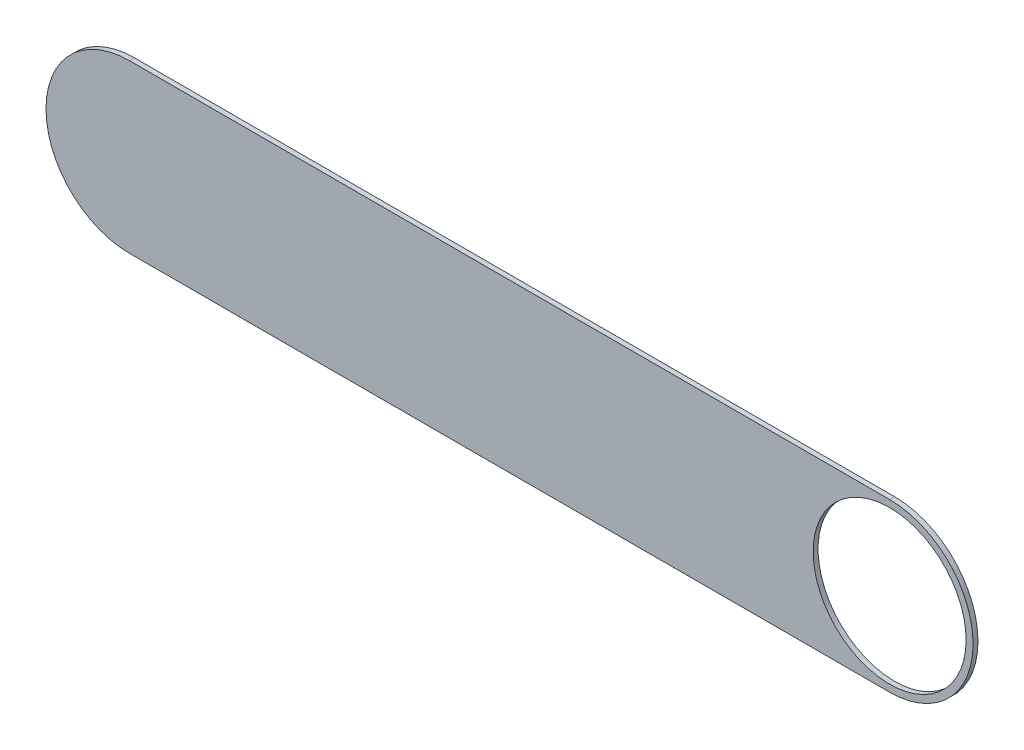
ISO-10303-21;
HEADER;
FILE_DESCRIPTION(('STEP AP214'),'2;1');
FILE_NAME('part.step','',(''),(''),'','','');
FILE_SCHEMA(('AUTOMOTIVE_DESIGN { 1 0 10303 214 1 1 1 1 }'));
ENDSEC;
DATA;
#1=APPLICATION_CONTEXT('core data for automotive mechanical design processes');
#2=APPLICATION_PROTOCOL_DEFINITION('international standard','automotive_design',2000,#1);
#3=PRODUCT_CONTEXT('',#1,'mechanical');
#4=PRODUCT('Part','Part','',(#3));
#5=PRODUCT_RELATED_PRODUCT_CATEGORY('part','',(#4));
#6=PRODUCT_DEFINITION_FORMATION('','',#4);
#7=PRODUCT_DEFINITION_CONTEXT('part definition',#1,'design');
#8=PRODUCT_DEFINITION('design','',#6,#7);
#9=PRODUCT_DEFINITION_SHAPE('','',#8);
#10=(LENGTH_UNIT() NAMED_UNIT(*) SI_UNIT(.MILLI.,.METRE.));
#11=(NAMED_UNIT(*) PLANE_ANGLE_UNIT() SI_UNIT($,.RADIAN.));
#12=(NAMED_UNIT(*) SI_UNIT($,.STERADIAN.) SOLID_ANGLE_UNIT());
#13=UNCERTAINTY_MEASURE_WITH_UNIT(LENGTH_MEASURE(1.E-05),#10,'distance_accuracy_value','');
#14=(GEOMETRIC_REPRESENTATION_CONTEXT(3) GLOBAL_UNCERTAINTY_ASSIGNED_CONTEXT((#13)) GLOBAL_UNIT_ASSIGNED_CONTEXT((#10,
#11,#12)) REPRESENTATION_CONTEXT('',''));
#15=CARTESIAN_POINT('',(0.,0.,0.));
#16=DIRECTION('',(0.,0.,1.));
#17=DIRECTION('',(1.,0.,0.));
#18=AXIS2_PLACEMENT_3D('',#15,#16,#17);
#19=CARTESIAN_POINT('',(91.2368,69.980048,0.));
#20=DIRECTION('',(0.,1.,0.));
#21=DIRECTION('',(1.,0.,0.));
#22=AXIS2_PLACEMENT_3D('',#19,#20,#21);
#23=PLANE('',#22);
#24=DIRECTION('',(1.,0.,0.));
#25=VECTOR('',#24,1.);
#26=CARTESIAN_POINT('',(91.2368,69.980048,0.03556));
#27=LINE('',#26,#25);
#28=CARTESIAN_POINT('',(91.2368,69.980048,0.03556));
#29=VERTEX_POINT('',#28);
#30=CARTESIAN_POINT('',(96.70415,69.980048,0.03556));
#31=VERTEX_POINT('',#30);
#32=EDGE_CURVE('E11',#29,#31,#27,.T.);
#33=ORIENTED_EDGE('',*,*,#32,.F.);
#34=DIRECTION('',(0.,0.,1.));
#35=VECTOR('',#34,1.);
#36=CARTESIAN_POINT('',(91.2368,69.980048,0.));
#37=LINE('',#36,#35);
#38=CARTESIAN_POINT('',(91.2368,69.980048,0.));
#39=VERTEX_POINT('',#38);
#40=EDGE_CURVE('E24',#39,#29,#37,.T.);
#41=ORIENTED_EDGE('',*,*,#40,.F.);
#42=DIRECTION('',(1.,0.,0.));
#43=VECTOR('',#42,1.);
#44=CARTESIAN_POINT('',(91.2368,69.980048,0.));
#45=LINE('',#44,#43);
#46=CARTESIAN_POINT('',(96.70415,69.980048,0.));
#47=VERTEX_POINT('',#46);
#48=EDGE_CURVE('E96',#39,#47,#45,.T.);
#49=ORIENTED_EDGE('',*,*,#48,.T.);
#50=DIRECTION('',(0.,0.,1.));
#51=VECTOR('',#50,1.);
#52=CARTESIAN_POINT('',(96.70415,69.980048,0.));
#53=LINE('',#52,#51);
#54=EDGE_CURVE('E37',#47,#31,#53,.T.);
#55=ORIENTED_EDGE('',*,*,#54,.T.);
#56=EDGE_LOOP('',(#33,#41,#49,#55));
#57=FACE_BOUND('',#56,.T.);
#58=ADVANCED_FACE('F17',(#57),#23,.F.);
#59=CARTESIAN_POINT('',(91.2368,70.5800468,0.));
#60=DIRECTION('',(0.,0.,-1.));
#61=DIRECTION('',(0.,1.,0.));
#62=AXIS2_PLACEMENT_3D('',#59,#60,#61);
#63=CYLINDRICAL_SURFACE('',#62,0.599998800000004);
#64=CARTESIAN_POINT('',(91.2368,70.5800468,0.03556));
#65=DIRECTION('',(0.,0.,1.));
#66=DIRECTION('',(0.,1.,0.));
#67=AXIS2_PLACEMENT_3D('',#64,#65,#66);
#68=CIRCLE('',#67,0.599998800000004);
#69=CARTESIAN_POINT('',(91.2368,71.1800456,0.03556));
#70=VERTEX_POINT('',#69);
#71=EDGE_CURVE('E92',#70,#29,#68,.T.);
#72=ORIENTED_EDGE('',*,*,#71,.F.);
#73=DIRECTION('',(0.,0.,1.));
#74=VECTOR('',#73,1.);
#75=CARTESIAN_POINT('',(91.2368,71.1800456,0.));
#76=LINE('',#75,#74);
#77=CARTESIAN_POINT('',(91.2368,71.1800456,0.));
#78=VERTEX_POINT('',#77);
#79=EDGE_CURVE('E90',#78,#70,#76,.T.);
#80=ORIENTED_EDGE('',*,*,#79,.F.);
#81=CARTESIAN_POINT('',(91.2368,70.5800468,0.));
#82=DIRECTION('',(0.,0.,1.));
#83=DIRECTION('',(0.,1.,0.));
#84=AXIS2_PLACEMENT_3D('',#81,#82,#83);
#85=CIRCLE('',#84,0.599998800000004);
#86=EDGE_CURVE('E88',#78,#39,#85,.T.);
#87=ORIENTED_EDGE('',*,*,#86,.T.);
#88=ORIENTED_EDGE('',*,*,#40,.T.);
#89=EDGE_LOOP('',(#72,#80,#87,#88));
#90=FACE_BOUND('',#89,.T.);
#91=ADVANCED_FACE('F111',(#90),#63,.T.);
#92=CARTESIAN_POINT('',(96.70415,70.5800468,0.));
#93=DIRECTION('',(0.,0.,-1.));
#94=DIRECTION('',(0.,-1.,0.));
#95=AXIS2_PLACEMENT_3D('',#92,#93,#94);
#96=CYLINDRICAL_SURFACE('',#95,0.599998800000004);
#97=CARTESIAN_POINT('',(96.70415,70.5800468,0.03556));
#98=DIRECTION('',(0.,0.,1.));
#99=DIRECTION('',(0.,-1.,0.));
#100=AXIS2_PLACEMENT_3D('',#97,#98,#99);
#101=CIRCLE('',#100,0.599998800000004);
#102=CARTESIAN_POINT('',(96.70415,71.1800456,0.03556));
#103=VERTEX_POINT('',#102);
#104=EDGE_CURVE('E85',#31,#103,#101,.T.);
#105=ORIENTED_EDGE('',*,*,#104,.F.);
#106=ORIENTED_EDGE('',*,*,#54,.F.);
#107=CARTESIAN_POINT('',(96.70415,70.5800468,0.));
#108=DIRECTION('',(0.,0.,1.));
#109=DIRECTION('',(0.,-1.,0.));
#110=AXIS2_PLACEMENT_3D('',#107,#108,#109);
#111=CIRCLE('',#110,0.599998800000004);
#112=CARTESIAN_POINT('',(96.70415,71.1800456,0.));
#113=VERTEX_POINT('',#112);
#114=EDGE_CURVE('E82',#47,#113,#111,.T.);
#115=ORIENTED_EDGE('',*,*,#114,.T.);
#116=DIRECTION('',(0.,0.,1.));
#117=VECTOR('',#116,1.);
#118=CARTESIAN_POINT('',(96.70415,71.1800456,0.));
#119=LINE('',#118,#117);
#120=EDGE_CURVE('E80',#113,#103,#119,.T.);
#121=ORIENTED_EDGE('',*,*,#120,.T.);
#122=EDGE_LOOP('',(#105,#106,#115,#121));
#123=FACE_BOUND('',#122,.T.);
#124=ADVANCED_FACE('F104',(#123),#96,.T.);
#125=CARTESIAN_POINT('',(96.70415,71.1800456,0.));
#126=DIRECTION('',(0.,-1.,0.));
#127=DIRECTION('',(-1.,0.,0.));
#128=AXIS2_PLACEMENT_3D('',#125,#126,#127);
#129=PLANE('',#128);
#130=DIRECTION('',(-1.,0.,0.));
#131=VECTOR('',#130,1.);
#132=CARTESIAN_POINT('',(96.70415,71.1800456,0.03556));
#133=LINE('',#132,#131);
#134=EDGE_CURVE('E77',#103,#70,#133,.T.);
#135=ORIENTED_EDGE('',*,*,#134,.F.);
#136=ORIENTED_EDGE('',*,*,#120,.F.);
#137=DIRECTION('',(-1.,0.,0.));
#138=VECTOR('',#137,1.);
#139=CARTESIAN_POINT('',(96.70415,71.1800456,0.));
#140=LINE('',#139,#138);
#141=EDGE_CURVE('E68',#113,#78,#140,.T.);
#142=ORIENTED_EDGE('',*,*,#141,.T.);
#143=ORIENTED_EDGE('',*,*,#79,.T.);
#144=EDGE_LOOP('',(#135,#136,#142,#143));
#145=FACE_BOUND('',#144,.T.);
#146=ADVANCED_FACE('F110',(#145),#129,.F.);
#147=CARTESIAN_POINT('',(96.70415,70.5800468,0.));
#148=DIRECTION('',(0.,0.,-1.));
#149=DIRECTION('',(1.,0.,0.));
#150=AXIS2_PLACEMENT_3D('',#147,#148,#149);
#151=CYLINDRICAL_SURFACE('',#150,0.5499989);
#152=DIRECTION('',(0.,0.,1.));
#153=VECTOR('',#152,1.);
#154=CARTESIAN_POINT('',(97.2541489,70.5800468,0.));
#155=LINE('',#154,#153);
#156=CARTESIAN_POINT('',(97.2541489,70.5800468,0.));
#157=VERTEX_POINT('',#156);
#158=CARTESIAN_POINT('',(97.2541489,70.5800468,0.03556));
#159=VERTEX_POINT('',#158);
#160=EDGE_CURVE('E62',#157,#159,#155,.T.);
#161=ORIENTED_EDGE('',*,*,#160,.T.);
#162=CARTESIAN_POINT('',(96.70415,70.5800468,0.03556));
#163=DIRECTION('',(0.,0.,1.));
#164=DIRECTION('',(1.,0.,0.));
#165=AXIS2_PLACEMENT_3D('',#162,#163,#164);
#166=CIRCLE('',#165,0.5499989);
#167=EDGE_CURVE('E67',#159,#159,#166,.T.);
#168=ORIENTED_EDGE('',*,*,#167,.T.);
#169=ORIENTED_EDGE('',*,*,#160,.F.);
#170=CARTESIAN_POINT('',(96.70415,70.5800468,0.));
#171=DIRECTION('',(0.,0.,1.));
#172=DIRECTION('',(1.,0.,0.));
#173=AXIS2_PLACEMENT_3D('',#170,#171,#172);
#174=CIRCLE('',#173,0.5499989);
#175=EDGE_CURVE('E65',#157,#157,#174,.T.);
#176=ORIENTED_EDGE('',*,*,#175,.F.);
#177=EDGE_LOOP('',(#161,#168,#169,#176));
#178=FACE_BOUND('',#177,.T.);
#179=ADVANCED_FACE('F64',(#178),#151,.F.);
#180=CARTESIAN_POINT('',(91.2368,69.980048,0.));
#181=DIRECTION('',(0.,0.,-1.));
#182=DIRECTION('',(-1.,0.,0.));
#183=AXIS2_PLACEMENT_3D('',#180,#181,#182);
#184=PLANE('',#183);
#185=ORIENTED_EDGE('',*,*,#48,.F.);
#186=ORIENTED_EDGE('',*,*,#86,.F.);
#187=ORIENTED_EDGE('',*,*,#141,.F.);
#188=ORIENTED_EDGE('',*,*,#114,.F.);
#189=EDGE_LOOP('',(#185,#186,#187,#188));
#190=FACE_BOUND('',#189,.T.);
#191=ORIENTED_EDGE('',*,*,#175,.T.);
#192=EDGE_LOOP('',(#191));
#193=FACE_BOUND('',#192,.T.);
#194=ADVANCED_FACE('F71',(#190,#193),#184,.T.);
#195=CARTESIAN_POINT('',(91.2368,69.980048,0.03556));
#196=DIRECTION('',(0.,0.,-1.));
#197=DIRECTION('',(-1.,0.,0.));
#198=AXIS2_PLACEMENT_3D('',#195,#196,#197);
#199=PLANE('',#198);
#200=ORIENTED_EDGE('',*,*,#134,.T.);
#201=ORIENTED_EDGE('',*,*,#71,.T.);
#202=ORIENTED_EDGE('',*,*,#32,.T.);
#203=ORIENTED_EDGE('',*,*,#104,.T.);
#204=EDGE_LOOP('',(#200,#201,#202,#203));
#205=FACE_BOUND('',#204,.T.);
#206=ORIENTED_EDGE('',*,*,#167,.F.);
#207=EDGE_LOOP('',(#206));
#208=FACE_BOUND('',#207,.T.);
#209=ADVANCED_FACE('F107',(#205,#208),#199,.F.);
#210=CLOSED_SHELL('',(#58,#91,#124,#146,#179,#194,#209));
#211=MANIFOLD_SOLID_BREP('B1',#210);
#212=ADVANCED_BREP_SHAPE_REPRESENTATION('',(#18,#211),#14);
#213=SHAPE_DEFINITION_REPRESENTATION(#9,#212);
ENDSEC;
END-ISO-10303-21;
